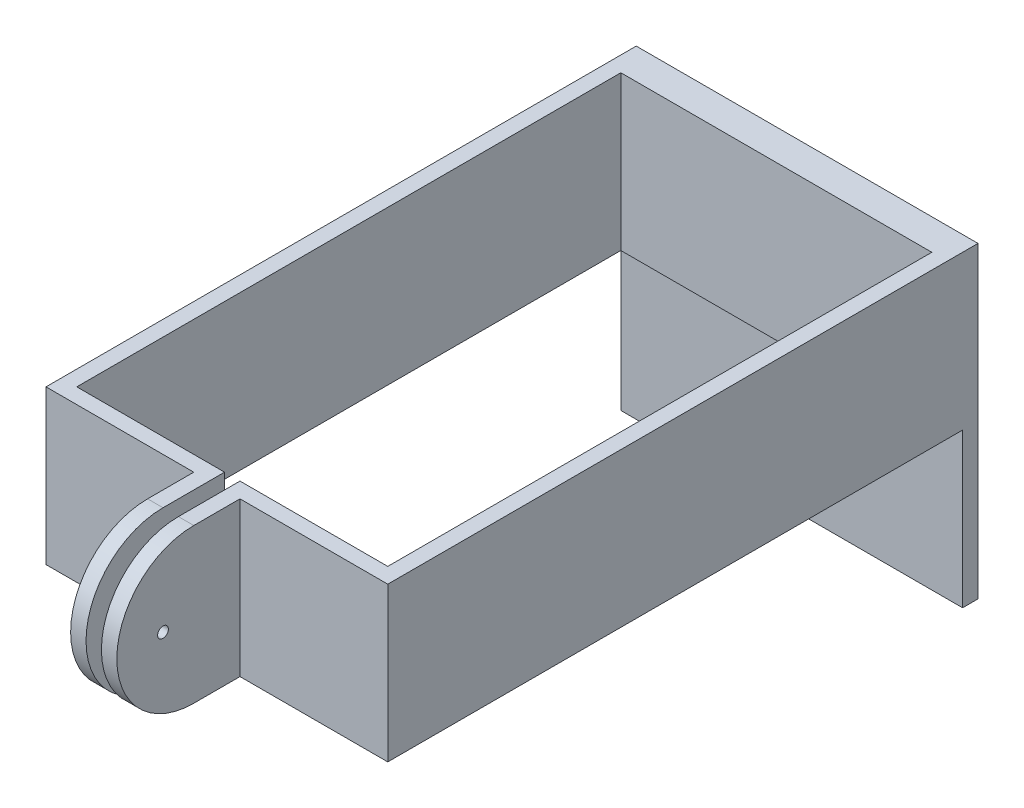
ISO-10303-21;
HEADER;
FILE_DESCRIPTION(('STEP AP214'),'2;1');
FILE_NAME('part.step','',(''),(''),'','','');
FILE_SCHEMA(('AUTOMOTIVE_DESIGN { 1 0 10303 214 1 1 1 1 }'));
ENDSEC;
DATA;
#1=APPLICATION_CONTEXT('core data for automotive mechanical design processes');
#2=APPLICATION_PROTOCOL_DEFINITION('international standard','automotive_design',2000,#1);
#3=PRODUCT_CONTEXT('',#1,'mechanical');
#4=PRODUCT('Part','Part','',(#3));
#5=PRODUCT_RELATED_PRODUCT_CATEGORY('part','',(#4));
#6=PRODUCT_DEFINITION_FORMATION('','',#4);
#7=PRODUCT_DEFINITION_CONTEXT('part definition',#1,'design');
#8=PRODUCT_DEFINITION('design','',#6,#7);
#9=PRODUCT_DEFINITION_SHAPE('','',#8);
#10=(LENGTH_UNIT() NAMED_UNIT(*) SI_UNIT(.MILLI.,.METRE.));
#11=(NAMED_UNIT(*) PLANE_ANGLE_UNIT() SI_UNIT($,.RADIAN.));
#12=(NAMED_UNIT(*) SI_UNIT($,.STERADIAN.) SOLID_ANGLE_UNIT());
#13=UNCERTAINTY_MEASURE_WITH_UNIT(LENGTH_MEASURE(1.E-05),#10,'distance_accuracy_value','');
#14=(GEOMETRIC_REPRESENTATION_CONTEXT(3) GLOBAL_UNCERTAINTY_ASSIGNED_CONTEXT((#13)) GLOBAL_UNIT_ASSIGNED_CONTEXT((#10,
#11,#12)) REPRESENTATION_CONTEXT('',''));
#15=CARTESIAN_POINT('',(0.,0.,0.));
#16=DIRECTION('',(0.,0.,1.));
#17=DIRECTION('',(1.,0.,0.));
#18=AXIS2_PLACEMENT_3D('',#15,#16,#17);
#19=CARTESIAN_POINT('',(58.,25.,20.));
#20=DIRECTION('',(1.,0.,0.));
#21=DIRECTION('',(0.,0.,-1.));
#22=AXIS2_PLACEMENT_3D('',#19,#20,#21);
#23=CYLINDRICAL_SURFACE('',#22,25.);
#24=DIRECTION('',(-1.,0.,0.));
#25=VECTOR('',#24,1.);
#26=CARTESIAN_POINT('',(58.,0.,20.));
#27=LINE('',#26,#25);
#28=CARTESIAN_POINT('',(58.,0.,20.));
#29=VERTEX_POINT('',#28);
#30=CARTESIAN_POINT('',(53.,0.,20.));
#31=VERTEX_POINT('',#30);
#32=EDGE_CURVE('E294',#29,#31,#27,.T.);
#33=ORIENTED_EDGE('',*,*,#32,.F.);
#34=CARTESIAN_POINT('',(58.,25.,20.));
#35=DIRECTION('',(-1.,0.,0.));
#36=DIRECTION('',(0.,0.,1.));
#37=AXIS2_PLACEMENT_3D('',#34,#35,#36);
#38=CIRCLE('',#37,25.);
#39=CARTESIAN_POINT('',(58.,50.,20.));
#40=VERTEX_POINT('',#39);
#41=EDGE_CURVE('E48',#40,#29,#38,.F.);
#42=ORIENTED_EDGE('',*,*,#41,.F.);
#43=DIRECTION('',(1.,0.,0.));
#44=VECTOR('',#43,1.);
#45=CARTESIAN_POINT('',(0.,50.,20.));
#46=LINE('',#45,#44);
#47=CARTESIAN_POINT('',(53.,50.,20.));
#48=VERTEX_POINT('',#47);
#49=EDGE_CURVE('E297',#48,#40,#46,.T.);
#50=ORIENTED_EDGE('',*,*,#49,.F.);
#51=CARTESIAN_POINT('',(53.,25.,20.));
#52=DIRECTION('',(1.,0.,0.));
#53=DIRECTION('',(0.,0.,-1.));
#54=AXIS2_PLACEMENT_3D('',#51,#52,#53);
#55=CIRCLE('',#54,25.);
#56=EDGE_CURVE('E11',#31,#48,#55,.F.);
#57=ORIENTED_EDGE('',*,*,#56,.F.);
#58=EDGE_LOOP('',(#33,#42,#50,#57));
#59=FACE_BOUND('',#58,.T.);
#60=ADVANCED_FACE('F39',(#59),#23,.T.);
#61=CARTESIAN_POINT('',(48.,25.,20.));
#62=DIRECTION('',(1.,0.,0.));
#63=DIRECTION('',(0.,0.,-1.));
#64=AXIS2_PLACEMENT_3D('',#61,#62,#63);
#65=CYLINDRICAL_SURFACE('',#64,25.);
#66=DIRECTION('',(-1.,0.,0.));
#67=VECTOR('',#66,1.);
#68=CARTESIAN_POINT('',(48.,0.,20.));
#69=LINE('',#68,#67);
#70=CARTESIAN_POINT('',(48.,0.,20.));
#71=VERTEX_POINT('',#70);
#72=CARTESIAN_POINT('',(43.,0.,20.));
#73=VERTEX_POINT('',#72);
#74=EDGE_CURVE('E284',#71,#73,#69,.T.);
#75=ORIENTED_EDGE('',*,*,#74,.F.);
#76=CARTESIAN_POINT('',(48.,25.,20.));
#77=DIRECTION('',(-1.,0.,0.));
#78=DIRECTION('',(0.,0.,1.));
#79=AXIS2_PLACEMENT_3D('',#76,#77,#78);
#80=CIRCLE('',#79,25.);
#81=CARTESIAN_POINT('',(48.,50.,20.));
#82=VERTEX_POINT('',#81);
#83=EDGE_CURVE('E290',#82,#71,#80,.F.);
#84=ORIENTED_EDGE('',*,*,#83,.F.);
#85=DIRECTION('',(1.,0.,0.));
#86=VECTOR('',#85,1.);
#87=CARTESIAN_POINT('',(0.,50.,20.));
#88=LINE('',#87,#86);
#89=CARTESIAN_POINT('',(43.,50.,20.));
#90=VERTEX_POINT('',#89);
#91=EDGE_CURVE('E287',#90,#82,#88,.T.);
#92=ORIENTED_EDGE('',*,*,#91,.F.);
#93=CARTESIAN_POINT('',(43.,25.,20.));
#94=DIRECTION('',(1.,0.,0.));
#95=DIRECTION('',(0.,0.,-1.));
#96=AXIS2_PLACEMENT_3D('',#93,#94,#95);
#97=CIRCLE('',#96,25.);
#98=EDGE_CURVE('E292',#73,#90,#97,.F.);
#99=ORIENTED_EDGE('',*,*,#98,.F.);
#100=EDGE_LOOP('',(#75,#84,#92,#99));
#101=FACE_BOUND('',#100,.T.);
#102=ADVANCED_FACE('F347',(#101),#65,.T.);
#103=CARTESIAN_POINT('',(48.,50.,0.));
#104=DIRECTION('',(0.,0.,1.));
#105=DIRECTION('',(1.,0.,0.));
#106=AXIS2_PLACEMENT_3D('',#103,#104,#105);
#107=PLANE('',#106);
#108=DIRECTION('',(-1.,0.,0.));
#109=VECTOR('',#108,1.);
#110=CARTESIAN_POINT('',(48.,0.,0.));
#111=LINE('',#110,#109);
#112=CARTESIAN_POINT('',(48.,0.,0.));
#113=VERTEX_POINT('',#112);
#114=CARTESIAN_POINT('',(0.,0.,0.));
#115=VERTEX_POINT('',#114);
#116=EDGE_CURVE('E189',#113,#115,#111,.T.);
#117=ORIENTED_EDGE('',*,*,#116,.T.);
#118=DIRECTION('',(0.,-1.,0.));
#119=VECTOR('',#118,1.);
#120=CARTESIAN_POINT('',(0.,50.,0.));
#121=LINE('',#120,#119);
#122=CARTESIAN_POINT('',(0.,50.,0.));
#123=VERTEX_POINT('',#122);
#124=EDGE_CURVE('E281',#123,#115,#121,.T.);
#125=ORIENTED_EDGE('',*,*,#124,.F.);
#126=DIRECTION('',(-1.,0.,0.));
#127=VECTOR('',#126,1.);
#128=CARTESIAN_POINT('',(48.,50.,0.));
#129=LINE('',#128,#127);
#130=CARTESIAN_POINT('',(48.,50.,0.));
#131=VERTEX_POINT('',#130);
#132=EDGE_CURVE('E197',#131,#123,#129,.T.);
#133=ORIENTED_EDGE('',*,*,#132,.F.);
#134=DIRECTION('',(0.,-1.,0.));
#135=VECTOR('',#134,1.);
#136=CARTESIAN_POINT('',(48.,50.,0.));
#137=LINE('',#136,#135);
#138=EDGE_CURVE('E226',#131,#113,#137,.T.);
#139=ORIENTED_EDGE('',*,*,#138,.T.);
#140=EDGE_LOOP('',(#117,#125,#133,#139));
#141=FACE_BOUND('',#140,.T.);
#142=ADVANCED_FACE('F338',(#141),#107,.F.);
#143=CARTESIAN_POINT('',(0.,50.,0.));
#144=DIRECTION('',(-1.,0.,0.));
#145=DIRECTION('',(0.,0.,1.));
#146=AXIS2_PLACEMENT_3D('',#143,#144,#145);
#147=PLANE('',#146);
#148=DIRECTION('',(0.,0.,-1.));
#149=VECTOR('',#148,1.);
#150=CARTESIAN_POINT('',(0.,0.,0.));
#151=LINE('',#150,#149);
#152=CARTESIAN_POINT('',(0.,0.,-176.7));
#153=VERTEX_POINT('',#152);
#154=EDGE_CURVE('E192',#115,#153,#151,.T.);
#155=ORIENTED_EDGE('',*,*,#154,.T.);
#156=DIRECTION('',(0.,-1.,0.));
#157=VECTOR('',#156,1.);
#158=CARTESIAN_POINT('',(0.,50.,-176.7));
#159=LINE('',#158,#157);
#160=CARTESIAN_POINT('',(0.,50.,-176.7));
#161=VERTEX_POINT('',#160);
#162=EDGE_CURVE('E278',#161,#153,#159,.T.);
#163=ORIENTED_EDGE('',*,*,#162,.F.);
#164=DIRECTION('',(0.,0.,-1.));
#165=VECTOR('',#164,1.);
#166=CARTESIAN_POINT('',(0.,50.,0.));
#167=LINE('',#166,#165);
#168=EDGE_CURVE('E200',#123,#161,#167,.T.);
#169=ORIENTED_EDGE('',*,*,#168,.F.);
#170=ORIENTED_EDGE('',*,*,#124,.T.);
#171=EDGE_LOOP('',(#155,#163,#169,#170));
#172=FACE_BOUND('',#171,.T.);
#173=ADVANCED_FACE('F333',(#172),#147,.F.);
#174=CARTESIAN_POINT('',(0.,50.,-176.7));
#175=DIRECTION('',(0.,0.,-1.));
#176=DIRECTION('',(-1.,0.,0.));
#177=AXIS2_PLACEMENT_3D('',#174,#175,#176);
#178=PLANE('',#177);
#179=DIRECTION('',(1.,0.,0.));
#180=VECTOR('',#179,1.);
#181=CARTESIAN_POINT('',(0.,0.,-176.7));
#182=LINE('',#181,#180);
#183=CARTESIAN_POINT('',(101.,0.,-176.7));
#184=VERTEX_POINT('',#183);
#185=EDGE_CURVE('E229',#153,#184,#182,.T.);
#186=ORIENTED_EDGE('',*,*,#185,.T.);
#187=DIRECTION('',(0.,-1.,0.));
#188=VECTOR('',#187,1.);
#189=CARTESIAN_POINT('',(101.,50.,-176.7));
#190=LINE('',#189,#188);
#191=CARTESIAN_POINT('',(101.,50.,-176.7));
#192=VERTEX_POINT('',#191);
#193=EDGE_CURVE('E275',#192,#184,#190,.T.);
#194=ORIENTED_EDGE('',*,*,#193,.F.);
#195=DIRECTION('',(1.,0.,0.));
#196=VECTOR('',#195,1.);
#197=CARTESIAN_POINT('',(0.,50.,-176.7));
#198=LINE('',#197,#196);
#199=EDGE_CURVE('E203',#161,#192,#198,.T.);
#200=ORIENTED_EDGE('',*,*,#199,.F.);
#201=ORIENTED_EDGE('',*,*,#162,.T.);
#202=EDGE_LOOP('',(#186,#194,#200,#201));
#203=FACE_BOUND('',#202,.T.);
#204=ADVANCED_FACE('F330',(#203),#178,.F.);
#205=CARTESIAN_POINT('',(101.,50.,-176.7));
#206=DIRECTION('',(1.,0.,0.));
#207=DIRECTION('',(0.,0.,-1.));
#208=AXIS2_PLACEMENT_3D('',#205,#206,#207);
#209=PLANE('',#208);
#210=DIRECTION('',(0.,0.,1.));
#211=VECTOR('',#210,1.);
#212=CARTESIAN_POINT('',(101.,0.,-176.7));
#213=LINE('',#212,#211);
#214=CARTESIAN_POINT('',(101.,0.,0.));
#215=VERTEX_POINT('',#214);
#216=EDGE_CURVE('E231',#184,#215,#213,.T.);
#217=ORIENTED_EDGE('',*,*,#216,.T.);
#218=DIRECTION('',(0.,-1.,0.));
#219=VECTOR('',#218,1.);
#220=CARTESIAN_POINT('',(101.,50.,0.));
#221=LINE('',#220,#219);
#222=CARTESIAN_POINT('',(101.,50.,0.));
#223=VERTEX_POINT('',#222);
#224=EDGE_CURVE('E272',#223,#215,#221,.T.);
#225=ORIENTED_EDGE('',*,*,#224,.F.);
#226=DIRECTION('',(0.,0.,1.));
#227=VECTOR('',#226,1.);
#228=CARTESIAN_POINT('',(101.,50.,-176.7));
#229=LINE('',#228,#227);
#230=EDGE_CURVE('E205',#192,#223,#229,.T.);
#231=ORIENTED_EDGE('',*,*,#230,.F.);
#232=ORIENTED_EDGE('',*,*,#193,.T.);
#233=EDGE_LOOP('',(#217,#225,#231,#232));
#234=FACE_BOUND('',#233,.T.);
#235=ADVANCED_FACE('F325',(#234),#209,.F.);
#236=CARTESIAN_POINT('',(101.,50.,0.));
#237=DIRECTION('',(0.,0.,1.));
#238=DIRECTION('',(1.,0.,0.));
#239=AXIS2_PLACEMENT_3D('',#236,#237,#238);
#240=PLANE('',#239);
#241=DIRECTION('',(-1.,0.,0.));
#242=VECTOR('',#241,1.);
#243=CARTESIAN_POINT('',(101.,0.,0.));
#244=LINE('',#243,#242);
#245=CARTESIAN_POINT('',(53.,0.,0.));
#246=VERTEX_POINT('',#245);
#247=EDGE_CURVE('E233',#215,#246,#244,.T.);
#248=ORIENTED_EDGE('',*,*,#247,.T.);
#249=DIRECTION('',(0.,-1.,0.));
#250=VECTOR('',#249,1.);
#251=CARTESIAN_POINT('',(53.,50.,0.));
#252=LINE('',#251,#250);
#253=CARTESIAN_POINT('',(53.,50.,0.));
#254=VERTEX_POINT('',#253);
#255=EDGE_CURVE('E269',#254,#246,#252,.T.);
#256=ORIENTED_EDGE('',*,*,#255,.F.);
#257=DIRECTION('',(-1.,0.,0.));
#258=VECTOR('',#257,1.);
#259=CARTESIAN_POINT('',(101.,50.,0.));
#260=LINE('',#259,#258);
#261=EDGE_CURVE('E207',#223,#254,#260,.T.);
#262=ORIENTED_EDGE('',*,*,#261,.F.);
#263=ORIENTED_EDGE('',*,*,#224,.T.);
#264=EDGE_LOOP('',(#248,#256,#262,#263));
#265=FACE_BOUND('',#264,.T.);
#266=ADVANCED_FACE('F319',(#265),#240,.F.);
#267=CARTESIAN_POINT('',(53.,50.,4.99999999999999));
#268=DIRECTION('',(1.,0.,0.));
#269=DIRECTION('',(0.,0.,-1.));
#270=AXIS2_PLACEMENT_3D('',#267,#268,#269);
#271=PLANE('',#270);
#272=CARTESIAN_POINT('',(53.,25.,30.));
#273=DIRECTION('',(1.,0.,0.));
#274=DIRECTION('',(0.,0.,-1.));
#275=AXIS2_PLACEMENT_3D('',#272,#273,#274);
#276=CIRCLE('',#275,1.75);
#277=CARTESIAN_POINT('',(53.,25.,28.25));
#278=VERTEX_POINT('',#277);
#279=EDGE_CURVE('E368',#278,#278,#276,.T.);
#280=ORIENTED_EDGE('',*,*,#279,.T.);
#281=EDGE_LOOP('',(#280));
#282=FACE_BOUND('',#281,.T.);
#283=DIRECTION('',(0.,0.,1.));
#284=VECTOR('',#283,1.);
#285=CARTESIAN_POINT('',(53.,0.,4.99999999999999));
#286=LINE('',#285,#284);
#287=EDGE_CURVE('E236',#246,#31,#286,.T.);
#288=ORIENTED_EDGE('',*,*,#287,.T.);
#289=ORIENTED_EDGE('',*,*,#56,.T.);
#290=DIRECTION('',(0.,0.,1.));
#291=VECTOR('',#290,1.);
#292=CARTESIAN_POINT('',(53.,50.,0.));
#293=LINE('',#292,#291);
#294=EDGE_CURVE('E209',#254,#48,#293,.T.);
#295=ORIENTED_EDGE('',*,*,#294,.F.);
#296=ORIENTED_EDGE('',*,*,#255,.T.);
#297=EDGE_LOOP('',(#288,#289,#295,#296));
#298=FACE_BOUND('',#297,.T.);
#299=ADVANCED_FACE('F317',(#282,#298),#271,.F.);
#300=CARTESIAN_POINT('',(58.,50.,45.));
#301=DIRECTION('',(-1.,0.,0.));
#302=DIRECTION('',(0.,0.,1.));
#303=AXIS2_PLACEMENT_3D('',#300,#301,#302);
#304=PLANE('',#303);
#305=CARTESIAN_POINT('',(58.,25.,30.));
#306=DIRECTION('',(-1.,0.,0.));
#307=DIRECTION('',(0.,0.,1.));
#308=AXIS2_PLACEMENT_3D('',#305,#306,#307);
#309=CIRCLE('',#308,1.75);
#310=CARTESIAN_POINT('',(58.,25.,31.75));
#311=VERTEX_POINT('',#310);
#312=EDGE_CURVE('E373',#311,#311,#309,.T.);
#313=ORIENTED_EDGE('',*,*,#312,.T.);
#314=EDGE_LOOP('',(#313));
#315=FACE_BOUND('',#314,.T.);
#316=DIRECTION('',(0.,0.,-1.));
#317=VECTOR('',#316,1.);
#318=CARTESIAN_POINT('',(58.,50.,45.));
#319=LINE('',#318,#317);
#320=CARTESIAN_POINT('',(58.,50.,4.99999999999999));
#321=VERTEX_POINT('',#320);
#322=EDGE_CURVE('E212',#40,#321,#319,.T.);
#323=ORIENTED_EDGE('',*,*,#322,.F.);
#324=ORIENTED_EDGE('',*,*,#41,.T.);
#325=DIRECTION('',(0.,0.,-1.));
#326=VECTOR('',#325,1.);
#327=CARTESIAN_POINT('',(58.,0.,45.));
#328=LINE('',#327,#326);
#329=CARTESIAN_POINT('',(58.,0.,4.99999999999999));
#330=VERTEX_POINT('',#329);
#331=EDGE_CURVE('E238',#29,#330,#328,.T.);
#332=ORIENTED_EDGE('',*,*,#331,.T.);
#333=DIRECTION('',(0.,-1.,0.));
#334=VECTOR('',#333,1.);
#335=CARTESIAN_POINT('',(58.,50.,4.99999999999999));
#336=LINE('',#335,#334);
#337=EDGE_CURVE('E266',#321,#330,#336,.T.);
#338=ORIENTED_EDGE('',*,*,#337,.F.);
#339=EDGE_LOOP('',(#323,#324,#332,#338));
#340=FACE_BOUND('',#339,.T.);
#341=ADVANCED_FACE('F301',(#315,#340),#304,.F.);
#342=CARTESIAN_POINT('',(58.,50.,4.99999999999999));
#343=DIRECTION('',(0.,0.,-1.));
#344=DIRECTION('',(-1.,0.,0.));
#345=AXIS2_PLACEMENT_3D('',#342,#343,#344);
#346=PLANE('',#345);
#347=DIRECTION('',(1.,0.,0.));
#348=VECTOR('',#347,1.);
#349=CARTESIAN_POINT('',(58.,0.,4.99999999999999));
#350=LINE('',#349,#348);
#351=CARTESIAN_POINT('',(106.,0.,4.99999999999999));
#352=VERTEX_POINT('',#351);
#353=EDGE_CURVE('E240',#330,#352,#350,.T.);
#354=ORIENTED_EDGE('',*,*,#353,.T.);
#355=DIRECTION('',(0.,-1.,0.));
#356=VECTOR('',#355,1.);
#357=CARTESIAN_POINT('',(106.,50.,4.99999999999999));
#358=LINE('',#357,#356);
#359=CARTESIAN_POINT('',(106.,50.,4.99999999999999));
#360=VERTEX_POINT('',#359);
#361=EDGE_CURVE('E263',#360,#352,#358,.T.);
#362=ORIENTED_EDGE('',*,*,#361,.F.);
#363=DIRECTION('',(1.,0.,0.));
#364=VECTOR('',#363,1.);
#365=CARTESIAN_POINT('',(58.,50.,4.99999999999999));
#366=LINE('',#365,#364);
#367=EDGE_CURVE('E214',#321,#360,#366,.T.);
#368=ORIENTED_EDGE('',*,*,#367,.F.);
#369=ORIENTED_EDGE('',*,*,#337,.T.);
#370=EDGE_LOOP('',(#354,#362,#368,#369));
#371=FACE_BOUND('',#370,.T.);
#372=ADVANCED_FACE('F311',(#371),#346,.F.);
#373=CARTESIAN_POINT('',(106.,50.,4.99999999999999));
#374=DIRECTION('',(-1.,0.,0.));
#375=DIRECTION('',(0.,0.,1.));
#376=AXIS2_PLACEMENT_3D('',#373,#374,#375);
#377=PLANE('',#376);
#378=DIRECTION('',(0.,0.,-1.));
#379=VECTOR('',#378,1.);
#380=CARTESIAN_POINT('',(106.,0.,4.99999999999999));
#381=LINE('',#380,#379);
#382=CARTESIAN_POINT('',(106.,0.,-181.7));
#383=VERTEX_POINT('',#382);
#384=EDGE_CURVE('E242',#352,#383,#381,.T.);
#385=ORIENTED_EDGE('',*,*,#384,.T.);
#386=DIRECTION('',(0.,-1.,0.));
#387=VECTOR('',#386,1.);
#388=CARTESIAN_POINT('',(106.,50.,-181.7));
#389=LINE('',#388,#387);
#390=CARTESIAN_POINT('',(106.,-50.,-181.7));
#391=VERTEX_POINT('',#390);
#392=EDGE_CURVE('E187',#383,#391,#389,.T.);
#393=ORIENTED_EDGE('',*,*,#392,.T.);
#394=DIRECTION('',(0.,0.,1.));
#395=VECTOR('',#394,1.);
#396=CARTESIAN_POINT('',(106.,-50.,-186.7));
#397=LINE('',#396,#395);
#398=CARTESIAN_POINT('',(106.,-50.,-186.7));
#399=VERTEX_POINT('',#398);
#400=EDGE_CURVE('E167',#399,#391,#397,.T.);
#401=ORIENTED_EDGE('',*,*,#400,.F.);
#402=DIRECTION('',(0.,-1.,0.));
#403=VECTOR('',#402,1.);
#404=CARTESIAN_POINT('',(106.,50.,-186.7));
#405=LINE('',#404,#403);
#406=CARTESIAN_POINT('',(106.,50.,-186.7));
#407=VERTEX_POINT('',#406);
#408=EDGE_CURVE('E174',#407,#399,#405,.T.);
#409=ORIENTED_EDGE('',*,*,#408,.F.);
#410=DIRECTION('',(0.,0.,-1.));
#411=VECTOR('',#410,1.);
#412=CARTESIAN_POINT('',(106.,50.,4.99999999999999));
#413=LINE('',#412,#411);
#414=EDGE_CURVE('E216',#360,#407,#413,.T.);
#415=ORIENTED_EDGE('',*,*,#414,.F.);
#416=ORIENTED_EDGE('',*,*,#361,.T.);
#417=EDGE_LOOP('',(#385,#393,#401,#409,#415,#416));
#418=FACE_BOUND('',#417,.T.);
#419=ADVANCED_FACE('F185',(#418),#377,.F.);
#420=CARTESIAN_POINT('',(-5.,50.,-181.7));
#421=DIRECTION('',(1.,0.,0.));
#422=DIRECTION('',(0.,0.,-1.));
#423=AXIS2_PLACEMENT_3D('',#420,#421,#422);
#424=PLANE('',#423);
#425=DIRECTION('',(0.,0.,1.));
#426=VECTOR('',#425,1.);
#427=CARTESIAN_POINT('',(-5.,0.,-181.7));
#428=LINE('',#427,#426);
#429=CARTESIAN_POINT('',(-5.00000000000001,0.,-181.7));
#430=VERTEX_POINT('',#429);
#431=CARTESIAN_POINT('',(-4.99999999999998,0.,5.00000000000001));
#432=VERTEX_POINT('',#431);
#433=EDGE_CURVE('E247',#430,#432,#428,.T.);
#434=ORIENTED_EDGE('',*,*,#433,.T.);
#435=DIRECTION('',(0.,-1.,0.));
#436=VECTOR('',#435,1.);
#437=CARTESIAN_POINT('',(-4.99999999999998,50.,5.00000000000001));
#438=LINE('',#437,#436);
#439=CARTESIAN_POINT('',(-4.99999999999998,50.,5.00000000000001));
#440=VERTEX_POINT('',#439);
#441=EDGE_CURVE('E260',#440,#432,#438,.T.);
#442=ORIENTED_EDGE('',*,*,#441,.F.);
#443=DIRECTION('',(0.,0.,1.));
#444=VECTOR('',#443,1.);
#445=CARTESIAN_POINT('',(-5.,50.,-181.7));
#446=LINE('',#445,#444);
#447=CARTESIAN_POINT('',(-5.,50.,-186.7));
#448=VERTEX_POINT('',#447);
#449=EDGE_CURVE('E218',#448,#440,#446,.T.);
#450=ORIENTED_EDGE('',*,*,#449,.F.);
#451=DIRECTION('',(0.,1.,0.));
#452=VECTOR('',#451,1.);
#453=CARTESIAN_POINT('',(-5.,50.,-186.7));
#454=LINE('',#453,#452);
#455=CARTESIAN_POINT('',(-5.00000000000002,-50.,-186.7));
#456=VERTEX_POINT('',#455);
#457=EDGE_CURVE('E173',#456,#448,#454,.T.);
#458=ORIENTED_EDGE('',*,*,#457,.F.);
#459=DIRECTION('',(0.,0.,1.));
#460=VECTOR('',#459,1.);
#461=CARTESIAN_POINT('',(-5.00000000000002,-50.,-186.7));
#462=LINE('',#461,#460);
#463=CARTESIAN_POINT('',(-5.00000000000002,-50.,-181.7));
#464=VERTEX_POINT('',#463);
#465=EDGE_CURVE('E169',#456,#464,#462,.T.);
#466=ORIENTED_EDGE('',*,*,#465,.T.);
#467=DIRECTION('',(0.,1.,0.));
#468=VECTOR('',#467,1.);
#469=CARTESIAN_POINT('',(-5.,50.,-181.7));
#470=LINE('',#469,#468);
#471=EDGE_CURVE('E183',#464,#430,#470,.T.);
#472=ORIENTED_EDGE('',*,*,#471,.T.);
#473=EDGE_LOOP('',(#434,#442,#450,#458,#466,#472));
#474=FACE_BOUND('',#473,.T.);
#475=ADVANCED_FACE('F363',(#474),#424,.F.);
#476=CARTESIAN_POINT('',(-4.99999999999998,50.,5.00000000000001));
#477=DIRECTION('',(0.,0.,-1.));
#478=DIRECTION('',(-1.,0.,0.));
#479=AXIS2_PLACEMENT_3D('',#476,#477,#478);
#480=PLANE('',#479);
#481=DIRECTION('',(1.,0.,0.));
#482=VECTOR('',#481,1.);
#483=CARTESIAN_POINT('',(-4.99999999999998,0.,5.00000000000001));
#484=LINE('',#483,#482);
#485=CARTESIAN_POINT('',(43.,0.,4.99999999999999));
#486=VERTEX_POINT('',#485);
#487=EDGE_CURVE('E249',#432,#486,#484,.T.);
#488=ORIENTED_EDGE('',*,*,#487,.T.);
#489=DIRECTION('',(0.,-1.,0.));
#490=VECTOR('',#489,1.);
#491=CARTESIAN_POINT('',(43.,50.,4.99999999999999));
#492=LINE('',#491,#490);
#493=CARTESIAN_POINT('',(43.,50.,4.99999999999999));
#494=VERTEX_POINT('',#493);
#495=EDGE_CURVE('E257',#494,#486,#492,.T.);
#496=ORIENTED_EDGE('',*,*,#495,.F.);
#497=DIRECTION('',(1.,0.,0.));
#498=VECTOR('',#497,1.);
#499=CARTESIAN_POINT('',(-4.99999999999998,50.,5.00000000000001));
#500=LINE('',#499,#498);
#501=EDGE_CURVE('E220',#440,#494,#500,.T.);
#502=ORIENTED_EDGE('',*,*,#501,.F.);
#503=ORIENTED_EDGE('',*,*,#441,.T.);
#504=EDGE_LOOP('',(#488,#496,#502,#503));
#505=FACE_BOUND('',#504,.T.);
#506=ADVANCED_FACE('F356',(#505),#480,.F.);
#507=CARTESIAN_POINT('',(43.,50.,45.));
#508=DIRECTION('',(1.,0.,0.));
#509=DIRECTION('',(0.,0.,-1.));
#510=AXIS2_PLACEMENT_3D('',#507,#508,#509);
#511=PLANE('',#510);
#512=CARTESIAN_POINT('',(43.,25.,30.));
#513=DIRECTION('',(-1.,0.,0.));
#514=DIRECTION('',(0.,0.,1.));
#515=AXIS2_PLACEMENT_3D('',#512,#513,#514);
#516=CIRCLE('',#515,1.75);
#517=CARTESIAN_POINT('',(43.,25.,31.75));
#518=VERTEX_POINT('',#517);
#519=EDGE_CURVE('E376',#518,#518,#516,.T.);
#520=ORIENTED_EDGE('',*,*,#519,.F.);
#521=EDGE_LOOP('',(#520));
#522=FACE_BOUND('',#521,.T.);
#523=DIRECTION('',(0.,0.,1.));
#524=VECTOR('',#523,1.);
#525=CARTESIAN_POINT('',(43.,0.,45.));
#526=LINE('',#525,#524);
#527=EDGE_CURVE('E251',#486,#73,#526,.T.);
#528=ORIENTED_EDGE('',*,*,#527,.T.);
#529=ORIENTED_EDGE('',*,*,#98,.T.);
#530=DIRECTION('',(0.,0.,1.));
#531=VECTOR('',#530,1.);
#532=CARTESIAN_POINT('',(43.,50.,45.));
#533=LINE('',#532,#531);
#534=EDGE_CURVE('E222',#494,#90,#533,.T.);
#535=ORIENTED_EDGE('',*,*,#534,.F.);
#536=ORIENTED_EDGE('',*,*,#495,.T.);
#537=EDGE_LOOP('',(#528,#529,#535,#536));
#538=FACE_BOUND('',#537,.T.);
#539=ADVANCED_FACE('F351',(#522,#538),#511,.F.);
#540=CARTESIAN_POINT('',(48.,50.,4.99999999999999));
#541=DIRECTION('',(-1.,0.,0.));
#542=DIRECTION('',(0.,0.,1.));
#543=AXIS2_PLACEMENT_3D('',#540,#541,#542);
#544=PLANE('',#543);
#545=CARTESIAN_POINT('',(48.,25.,30.));
#546=DIRECTION('',(-1.,0.,0.));
#547=DIRECTION('',(0.,0.,1.));
#548=AXIS2_PLACEMENT_3D('',#545,#546,#547);
#549=CIRCLE('',#548,1.75);
#550=CARTESIAN_POINT('',(48.,25.,31.75));
#551=VERTEX_POINT('',#550);
#552=EDGE_CURVE('E43',#551,#551,#549,.T.);
#553=ORIENTED_EDGE('',*,*,#552,.T.);
#554=EDGE_LOOP('',(#553));
#555=FACE_BOUND('',#554,.T.);
#556=DIRECTION('',(0.,0.,-1.));
#557=VECTOR('',#556,1.);
#558=CARTESIAN_POINT('',(48.,50.,4.99999999999999));
#559=LINE('',#558,#557);
#560=EDGE_CURVE('E225',#82,#131,#559,.T.);
#561=ORIENTED_EDGE('',*,*,#560,.F.);
#562=ORIENTED_EDGE('',*,*,#83,.T.);
#563=DIRECTION('',(0.,0.,-1.));
#564=VECTOR('',#563,1.);
#565=CARTESIAN_POINT('',(48.,0.,4.99999999999999));
#566=LINE('',#565,#564);
#567=EDGE_CURVE('E201',#71,#113,#566,.T.);
#568=ORIENTED_EDGE('',*,*,#567,.T.);
#569=ORIENTED_EDGE('',*,*,#138,.F.);
#570=EDGE_LOOP('',(#561,#562,#568,#569));
#571=FACE_BOUND('',#570,.T.);
#572=ADVANCED_FACE('F343',(#555,#571),#544,.F.);
#573=CARTESIAN_POINT('',(0.,50.,0.));
#574=DIRECTION('',(0.,-1.,0.));
#575=DIRECTION('',(0.,0.,-1.));
#576=AXIS2_PLACEMENT_3D('',#573,#574,#575);
#577=PLANE('',#576);
#578=ORIENTED_EDGE('',*,*,#294,.T.);
#579=ORIENTED_EDGE('',*,*,#49,.T.);
#580=ORIENTED_EDGE('',*,*,#322,.T.);
#581=ORIENTED_EDGE('',*,*,#367,.T.);
#582=ORIENTED_EDGE('',*,*,#414,.T.);
#583=DIRECTION('',(1.,0.,0.));
#584=VECTOR('',#583,1.);
#585=CARTESIAN_POINT('',(106.,50.,-186.7));
#586=LINE('',#585,#584);
#587=EDGE_CURVE('E180',#448,#407,#586,.T.);
#588=ORIENTED_EDGE('',*,*,#587,.F.);
#589=ORIENTED_EDGE('',*,*,#449,.T.);
#590=ORIENTED_EDGE('',*,*,#501,.T.);
#591=ORIENTED_EDGE('',*,*,#534,.T.);
#592=ORIENTED_EDGE('',*,*,#91,.T.);
#593=ORIENTED_EDGE('',*,*,#560,.T.);
#594=ORIENTED_EDGE('',*,*,#132,.T.);
#595=ORIENTED_EDGE('',*,*,#168,.T.);
#596=ORIENTED_EDGE('',*,*,#199,.T.);
#597=ORIENTED_EDGE('',*,*,#230,.T.);
#598=ORIENTED_EDGE('',*,*,#261,.T.);
#599=EDGE_LOOP('',(#578,#579,#580,#581,#582,#588,#589,#590,#591,#592,#593,#594,#595,#596,#597,#598));
#600=FACE_BOUND('',#599,.T.);
#601=ADVANCED_FACE('F314',(#600),#577,.F.);
#602=CARTESIAN_POINT('',(0.,0.,0.));
#603=DIRECTION('',(0.,-1.,0.));
#604=DIRECTION('',(0.,0.,-1.));
#605=AXIS2_PLACEMENT_3D('',#602,#603,#604);
#606=PLANE('',#605);
#607=ORIENTED_EDGE('',*,*,#331,.F.);
#608=ORIENTED_EDGE('',*,*,#32,.T.);
#609=ORIENTED_EDGE('',*,*,#287,.F.);
#610=ORIENTED_EDGE('',*,*,#247,.F.);
#611=ORIENTED_EDGE('',*,*,#216,.F.);
#612=ORIENTED_EDGE('',*,*,#185,.F.);
#613=ORIENTED_EDGE('',*,*,#154,.F.);
#614=ORIENTED_EDGE('',*,*,#116,.F.);
#615=ORIENTED_EDGE('',*,*,#567,.F.);
#616=ORIENTED_EDGE('',*,*,#74,.T.);
#617=ORIENTED_EDGE('',*,*,#527,.F.);
#618=ORIENTED_EDGE('',*,*,#487,.F.);
#619=ORIENTED_EDGE('',*,*,#433,.F.);
#620=DIRECTION('',(-1.,0.,0.));
#621=VECTOR('',#620,1.);
#622=CARTESIAN_POINT('',(106.,0.,-181.7));
#623=LINE('',#622,#621);
#624=EDGE_CURVE('E244',#383,#430,#623,.T.);
#625=ORIENTED_EDGE('',*,*,#624,.F.);
#626=ORIENTED_EDGE('',*,*,#384,.F.);
#627=ORIENTED_EDGE('',*,*,#353,.F.);
#628=EDGE_LOOP('',(#607,#608,#609,#610,#611,#612,#613,#614,#615,#616,#617,#618,#619,#625,#626,#627));
#629=FACE_BOUND('',#628,.T.);
#630=ADVANCED_FACE('F306',(#629),#606,.T.);
#631=CARTESIAN_POINT('',(0.,0.,-181.7));
#632=DIRECTION('',(0.,0.,-1.));
#633=DIRECTION('',(-1.,0.,0.));
#634=AXIS2_PLACEMENT_3D('',#631,#632,#633);
#635=PLANE('',#634);
#636=CARTESIAN_POINT('',(50.5,-30.,-181.7));
#637=DIRECTION('',(0.,0.,1.));
#638=DIRECTION('',(1.,0.,0.));
#639=AXIS2_PLACEMENT_3D('',#636,#637,#638);
#640=CIRCLE('',#639,5.);
#641=CARTESIAN_POINT('',(55.5,-30.,-181.7));
#642=VERTEX_POINT('',#641);
#643=EDGE_CURVE('E380',#642,#642,#640,.T.);
#644=ORIENTED_EDGE('',*,*,#643,.F.);
#645=EDGE_LOOP('',(#644));
#646=FACE_BOUND('',#645,.T.);
#647=ORIENTED_EDGE('',*,*,#392,.F.);
#648=ORIENTED_EDGE('',*,*,#624,.T.);
#649=ORIENTED_EDGE('',*,*,#471,.F.);
#650=DIRECTION('',(-1.,0.,0.));
#651=VECTOR('',#650,1.);
#652=CARTESIAN_POINT('',(106.,-50.,-181.7));
#653=LINE('',#652,#651);
#654=EDGE_CURVE('E364',#391,#464,#653,.T.);
#655=ORIENTED_EDGE('',*,*,#654,.F.);
#656=EDGE_LOOP('',(#647,#648,#649,#655));
#657=FACE_BOUND('',#656,.T.);
#658=ADVANCED_FACE('F362',(#646,#657),#635,.F.);
#659=CARTESIAN_POINT('',(106.,-50.,-186.7));
#660=DIRECTION('',(0.,1.,0.));
#661=DIRECTION('',(0.,0.,1.));
#662=AXIS2_PLACEMENT_3D('',#659,#660,#661);
#663=PLANE('',#662);
#664=ORIENTED_EDGE('',*,*,#654,.T.);
#665=ORIENTED_EDGE('',*,*,#465,.F.);
#666=DIRECTION('',(-1.,0.,0.));
#667=VECTOR('',#666,1.);
#668=CARTESIAN_POINT('',(106.,-50.,-186.7));
#669=LINE('',#668,#667);
#670=EDGE_CURVE('E163',#399,#456,#669,.T.);
#671=ORIENTED_EDGE('',*,*,#670,.F.);
#672=ORIENTED_EDGE('',*,*,#400,.T.);
#673=EDGE_LOOP('',(#664,#665,#671,#672));
#674=FACE_BOUND('',#673,.T.);
#675=ADVANCED_FACE('F165',(#674),#663,.F.);
#676=CARTESIAN_POINT('',(0.,0.,-186.7));
#677=DIRECTION('',(0.,0.,-1.));
#678=DIRECTION('',(-1.,0.,0.));
#679=AXIS2_PLACEMENT_3D('',#676,#677,#678);
#680=PLANE('',#679);
#681=CARTESIAN_POINT('',(50.5,-30.,-186.7));
#682=DIRECTION('',(0.,0.,1.));
#683=DIRECTION('',(1.,0.,0.));
#684=AXIS2_PLACEMENT_3D('',#681,#682,#683);
#685=CIRCLE('',#684,5.);
#686=CARTESIAN_POINT('',(55.5,-30.,-186.7));
#687=VERTEX_POINT('',#686);
#688=EDGE_CURVE('E379',#687,#687,#685,.T.);
#689=ORIENTED_EDGE('',*,*,#688,.T.);
#690=EDGE_LOOP('',(#689));
#691=FACE_BOUND('',#690,.T.);
#692=ORIENTED_EDGE('',*,*,#408,.T.);
#693=ORIENTED_EDGE('',*,*,#670,.T.);
#694=ORIENTED_EDGE('',*,*,#457,.T.);
#695=ORIENTED_EDGE('',*,*,#587,.T.);
#696=EDGE_LOOP('',(#692,#693,#694,#695));
#697=FACE_BOUND('',#696,.T.);
#698=ADVANCED_FACE('F178',(#691,#697),#680,.T.);
#699=CARTESIAN_POINT('',(106.,25.,30.));
#700=DIRECTION('',(-1.,0.,0.));
#701=DIRECTION('',(0.,0.,1.));
#702=AXIS2_PLACEMENT_3D('',#699,#700,#701);
#703=CYLINDRICAL_SURFACE('',#702,1.75);
#704=ORIENTED_EDGE('',*,*,#519,.T.);
#705=EDGE_LOOP('',(#704));
#706=FACE_BOUND('',#705,.T.);
#707=ORIENTED_EDGE('',*,*,#552,.F.);
#708=EDGE_LOOP('',(#707));
#709=FACE_BOUND('',#708,.T.);
#710=ADVANCED_FACE('F499',(#706,#709),#703,.F.);
#711=ORIENTED_EDGE('',*,*,#312,.F.);
#712=EDGE_LOOP('',(#711));
#713=FACE_BOUND('',#712,.T.);
#714=ORIENTED_EDGE('',*,*,#279,.F.);
#715=EDGE_LOOP('',(#714));
#716=FACE_BOUND('',#715,.T.);
#717=ADVANCED_FACE('F390',(#713,#716),#703,.F.);
#718=CARTESIAN_POINT('',(50.5,-30.,-186.7));
#719=DIRECTION('',(0.,0.,1.));
#720=DIRECTION('',(1.,0.,0.));
#721=AXIS2_PLACEMENT_3D('',#718,#719,#720);
#722=CYLINDRICAL_SURFACE('',#721,5.);
#723=ORIENTED_EDGE('',*,*,#688,.F.);
#724=EDGE_LOOP('',(#723));
#725=FACE_BOUND('',#724,.T.);
#726=ORIENTED_EDGE('',*,*,#643,.T.);
#727=EDGE_LOOP('',(#726));
#728=FACE_BOUND('',#727,.T.);
#729=ADVANCED_FACE('F387',(#725,#728),#722,.F.);
#730=CLOSED_SHELL('',(#60,#102,#142,#173,#204,#235,#266,#299,#341,#372,#419,#475,#506,#539,#572,
#601,#630,#658,#675,#698,#710,#717,#729));
#731=MANIFOLD_SOLID_BREP('B2',#730);
#732=ADVANCED_BREP_SHAPE_REPRESENTATION('',(#18,#731),#14);
#733=SHAPE_DEFINITION_REPRESENTATION(#9,#732);
ENDSEC;
END-ISO-10303-21;
